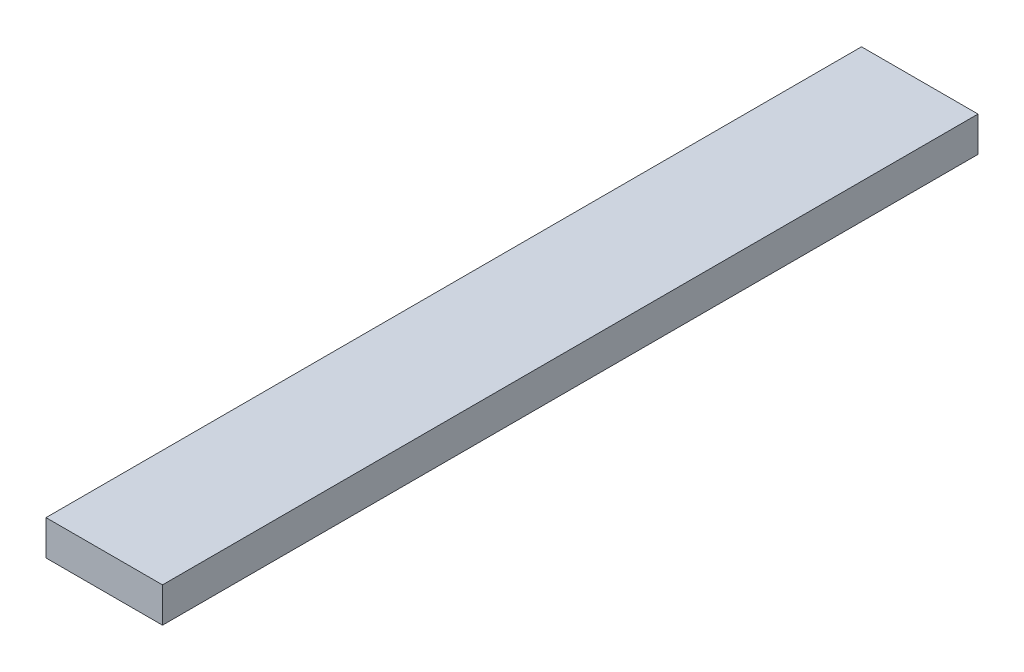
ISO-10303-21;
HEADER;
FILE_DESCRIPTION(('STEP AP214'),'2;1');
FILE_NAME('part.step','',(''),(''),'','','');
FILE_SCHEMA(('AUTOMOTIVE_DESIGN { 1 0 10303 214 1 1 1 1 }'));
ENDSEC;
DATA;
#1=APPLICATION_CONTEXT('core data for automotive mechanical design processes');
#2=APPLICATION_PROTOCOL_DEFINITION('international standard','automotive_design',2000,#1);
#3=PRODUCT_CONTEXT('',#1,'mechanical');
#4=PRODUCT('Part','Part','',(#3));
#5=PRODUCT_RELATED_PRODUCT_CATEGORY('part','',(#4));
#6=PRODUCT_DEFINITION_FORMATION('','',#4);
#7=PRODUCT_DEFINITION_CONTEXT('part definition',#1,'design');
#8=PRODUCT_DEFINITION('design','',#6,#7);
#9=PRODUCT_DEFINITION_SHAPE('','',#8);
#10=(LENGTH_UNIT() NAMED_UNIT(*) SI_UNIT(.MILLI.,.METRE.));
#11=(NAMED_UNIT(*) PLANE_ANGLE_UNIT() SI_UNIT($,.RADIAN.));
#12=(NAMED_UNIT(*) SI_UNIT($,.STERADIAN.) SOLID_ANGLE_UNIT());
#13=UNCERTAINTY_MEASURE_WITH_UNIT(LENGTH_MEASURE(1.E-05),#10,'distance_accuracy_value','');
#14=(GEOMETRIC_REPRESENTATION_CONTEXT(3) GLOBAL_UNCERTAINTY_ASSIGNED_CONTEXT((#13)) GLOBAL_UNIT_ASSIGNED_CONTEXT((#10,
#11,#12)) REPRESENTATION_CONTEXT('',''));
#15=CARTESIAN_POINT('',(0.,0.,0.));
#16=DIRECTION('',(0.,0.,1.));
#17=DIRECTION('',(1.,0.,0.));
#18=AXIS2_PLACEMENT_3D('',#15,#16,#17);
#19=CARTESIAN_POINT('',(-22.8574829448272,-13.3000000000014,12.7540000000006));
#20=DIRECTION('',(-1.,0.,0.));
#21=DIRECTION('',(0.,0.,1.));
#22=AXIS2_PLACEMENT_3D('',#19,#20,#21);
#23=PLANE('',#22);
#24=DIRECTION('',(0.,0.,-1.));
#25=VECTOR('',#24,1.);
#26=CARTESIAN_POINT('',(-22.8574829448272,-16.3000000000014,12.7540000000006));
#27=LINE('',#26,#25);
#28=CARTESIAN_POINT('',(-22.8574829448272,-16.3000000000014,12.7540000000006));
#29=VERTEX_POINT('',#28);
#30=CARTESIAN_POINT('',(-22.8574829448272,-16.3000000000014,-57.2459999999994));
#31=VERTEX_POINT('',#30);
#32=EDGE_CURVE('E99',#29,#31,#27,.T.);
#33=ORIENTED_EDGE('',*,*,#32,.F.);
#34=DIRECTION('',(0.,-1.,0.));
#35=VECTOR('',#34,1.);
#36=CARTESIAN_POINT('',(-22.8574829448272,-13.3000000000014,12.7540000000006));
#37=LINE('',#36,#35);
#38=CARTESIAN_POINT('',(-22.8574829448272,-13.3000000000014,12.7540000000006));
#39=VERTEX_POINT('',#38);
#40=EDGE_CURVE('E11',#39,#29,#37,.T.);
#41=ORIENTED_EDGE('',*,*,#40,.F.);
#42=DIRECTION('',(0.,0.,-1.));
#43=VECTOR('',#42,1.);
#44=CARTESIAN_POINT('',(-22.8574829448272,-13.3000000000014,12.7540000000006));
#45=LINE('',#44,#43);
#46=CARTESIAN_POINT('',(-22.8574829448272,-13.3000000000014,-57.2459999999994));
#47=VERTEX_POINT('',#46);
#48=EDGE_CURVE('E93',#39,#47,#45,.T.);
#49=ORIENTED_EDGE('',*,*,#48,.T.);
#50=DIRECTION('',(0.,-1.,0.));
#51=VECTOR('',#50,1.);
#52=CARTESIAN_POINT('',(-22.8574829448272,-13.3000000000014,-57.2459999999994));
#53=LINE('',#52,#51);
#54=EDGE_CURVE('E38',#47,#31,#53,.T.);
#55=ORIENTED_EDGE('',*,*,#54,.T.);
#56=EDGE_LOOP('',(#33,#41,#49,#55));
#57=FACE_BOUND('',#56,.T.);
#58=ADVANCED_FACE('F35',(#57),#23,.T.);
#59=CARTESIAN_POINT('',(-12.8574829448272,-13.3000000000014,12.7540000000006));
#60=DIRECTION('',(0.,0.,1.));
#61=DIRECTION('',(1.,0.,0.));
#62=AXIS2_PLACEMENT_3D('',#59,#60,#61);
#63=PLANE('',#62);
#64=DIRECTION('',(-1.,0.,0.));
#65=VECTOR('',#64,1.);
#66=CARTESIAN_POINT('',(-12.8574829448272,-16.3000000000014,12.7540000000006));
#67=LINE('',#66,#65);
#68=CARTESIAN_POINT('',(-12.8574829448272,-16.3000000000014,12.7540000000006));
#69=VERTEX_POINT('',#68);
#70=EDGE_CURVE('E95',#69,#29,#67,.T.);
#71=ORIENTED_EDGE('',*,*,#70,.F.);
#72=DIRECTION('',(0.,-1.,0.));
#73=VECTOR('',#72,1.);
#74=CARTESIAN_POINT('',(-12.8574829448272,-13.3000000000014,12.7540000000006));
#75=LINE('',#74,#73);
#76=CARTESIAN_POINT('',(-12.8574829448272,-13.3000000000014,12.7540000000006));
#77=VERTEX_POINT('',#76);
#78=EDGE_CURVE('E44',#77,#69,#75,.T.);
#79=ORIENTED_EDGE('',*,*,#78,.F.);
#80=DIRECTION('',(-1.,0.,0.));
#81=VECTOR('',#80,1.);
#82=CARTESIAN_POINT('',(-12.8574829448272,-13.3000000000014,12.7540000000006));
#83=LINE('',#82,#81);
#84=EDGE_CURVE('E90',#77,#39,#83,.T.);
#85=ORIENTED_EDGE('',*,*,#84,.T.);
#86=ORIENTED_EDGE('',*,*,#40,.T.);
#87=EDGE_LOOP('',(#71,#79,#85,#86));
#88=FACE_BOUND('',#87,.T.);
#89=ADVANCED_FACE('F109',(#88),#63,.T.);
#90=CARTESIAN_POINT('',(-12.8574829448272,-13.3000000000014,-57.2459999999994));
#91=DIRECTION('',(1.,0.,0.));
#92=DIRECTION('',(0.,0.,-1.));
#93=AXIS2_PLACEMENT_3D('',#90,#91,#92);
#94=PLANE('',#93);
#95=DIRECTION('',(0.,0.,1.));
#96=VECTOR('',#95,1.);
#97=CARTESIAN_POINT('',(-12.8574829448272,-16.3000000000014,-57.2459999999994));
#98=LINE('',#97,#96);
#99=CARTESIAN_POINT('',(-12.8574829448272,-16.3000000000014,-57.2459999999994));
#100=VERTEX_POINT('',#99);
#101=EDGE_CURVE('E85',#100,#69,#98,.T.);
#102=ORIENTED_EDGE('',*,*,#101,.F.);
#103=DIRECTION('',(0.,-1.,0.));
#104=VECTOR('',#103,1.);
#105=CARTESIAN_POINT('',(-12.8574829448272,-13.3000000000014,-57.2459999999994));
#106=LINE('',#105,#104);
#107=CARTESIAN_POINT('',(-12.8574829448272,-13.3000000000014,-57.2459999999994));
#108=VERTEX_POINT('',#107);
#109=EDGE_CURVE('E80',#108,#100,#106,.T.);
#110=ORIENTED_EDGE('',*,*,#109,.F.);
#111=DIRECTION('',(0.,0.,1.));
#112=VECTOR('',#111,1.);
#113=CARTESIAN_POINT('',(-12.8574829448272,-13.3000000000014,-57.2459999999994));
#114=LINE('',#113,#112);
#115=EDGE_CURVE('E83',#108,#77,#114,.T.);
#116=ORIENTED_EDGE('',*,*,#115,.T.);
#117=ORIENTED_EDGE('',*,*,#78,.T.);
#118=EDGE_LOOP('',(#102,#110,#116,#117));
#119=FACE_BOUND('',#118,.T.);
#120=ADVANCED_FACE('F82',(#119),#94,.T.);
#121=CARTESIAN_POINT('',(-22.8574829448272,-13.3000000000014,-57.2459999999994));
#122=DIRECTION('',(0.,0.,-1.));
#123=DIRECTION('',(-1.,0.,0.));
#124=AXIS2_PLACEMENT_3D('',#121,#122,#123);
#125=PLANE('',#124);
#126=DIRECTION('',(1.,0.,0.));
#127=VECTOR('',#126,1.);
#128=CARTESIAN_POINT('',(-22.8574829448272,-16.3000000000014,-57.2459999999994));
#129=LINE('',#128,#127);
#130=EDGE_CURVE('E102',#31,#100,#129,.T.);
#131=ORIENTED_EDGE('',*,*,#130,.F.);
#132=ORIENTED_EDGE('',*,*,#54,.F.);
#133=DIRECTION('',(1.,0.,0.));
#134=VECTOR('',#133,1.);
#135=CARTESIAN_POINT('',(-22.8574829448272,-13.3000000000014,-57.2459999999994));
#136=LINE('',#135,#134);
#137=EDGE_CURVE('E89',#47,#108,#136,.T.);
#138=ORIENTED_EDGE('',*,*,#137,.T.);
#139=ORIENTED_EDGE('',*,*,#109,.T.);
#140=EDGE_LOOP('',(#131,#132,#138,#139));
#141=FACE_BOUND('',#140,.T.);
#142=ADVANCED_FACE('F92',(#141),#125,.T.);
#143=CARTESIAN_POINT('',(0.,-13.3000000000014,0.));
#144=DIRECTION('',(0.,-1.,0.));
#145=DIRECTION('',(0.,0.,-1.));
#146=AXIS2_PLACEMENT_3D('',#143,#144,#145);
#147=PLANE('',#146);
#148=ORIENTED_EDGE('',*,*,#48,.F.);
#149=ORIENTED_EDGE('',*,*,#84,.F.);
#150=ORIENTED_EDGE('',*,*,#115,.F.);
#151=ORIENTED_EDGE('',*,*,#137,.F.);
#152=EDGE_LOOP('',(#148,#149,#150,#151));
#153=FACE_BOUND('',#152,.T.);
#154=ADVANCED_FACE('F88',(#153),#147,.F.);
#155=CARTESIAN_POINT('',(0.,-16.3000000000014,0.));
#156=DIRECTION('',(0.,-1.,0.));
#157=DIRECTION('',(0.,0.,-1.));
#158=AXIS2_PLACEMENT_3D('',#155,#156,#157);
#159=PLANE('',#158);
#160=ORIENTED_EDGE('',*,*,#32,.T.);
#161=ORIENTED_EDGE('',*,*,#130,.T.);
#162=ORIENTED_EDGE('',*,*,#101,.T.);
#163=ORIENTED_EDGE('',*,*,#70,.T.);
#164=EDGE_LOOP('',(#160,#161,#162,#163));
#165=FACE_BOUND('',#164,.T.);
#166=ADVANCED_FACE('F108',(#165),#159,.T.);
#167=CLOSED_SHELL('',(#58,#89,#120,#142,#154,#166));
#168=MANIFOLD_SOLID_BREP('B2',#167);
#169=ADVANCED_BREP_SHAPE_REPRESENTATION('',(#18,#168),#14);
#170=SHAPE_DEFINITION_REPRESENTATION(#9,#169);
ENDSEC;
END-ISO-10303-21;
